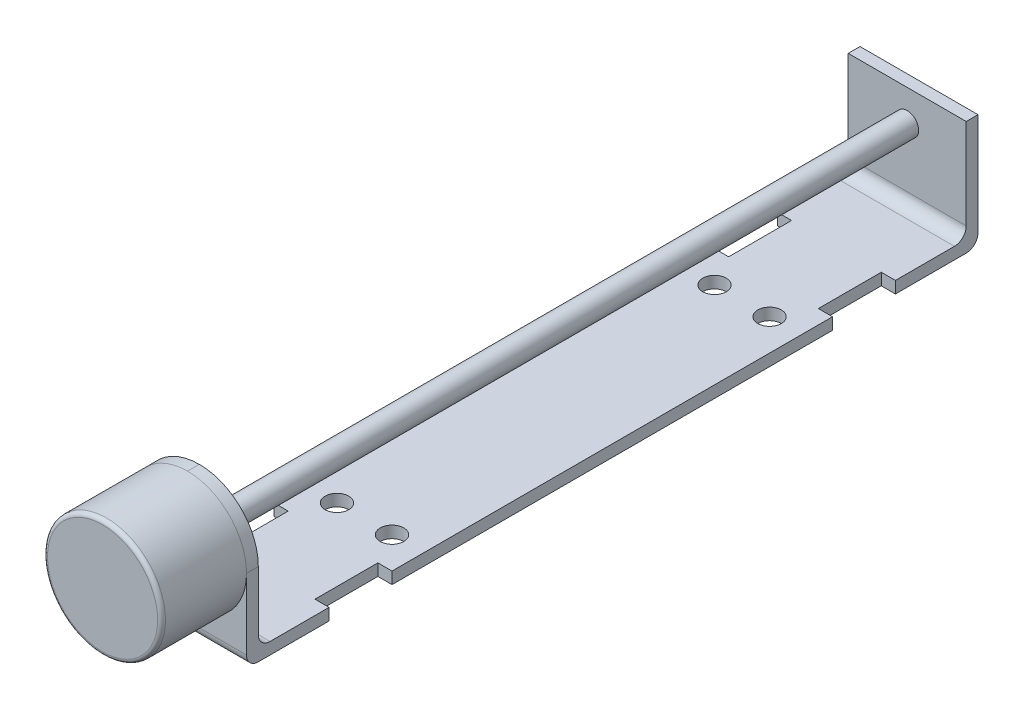
ISO-10303-21;
HEADER;
FILE_DESCRIPTION(('STEP AP214'),'2;1');
FILE_NAME('part.step','',(''),(''),'','','');
FILE_SCHEMA(('AUTOMOTIVE_DESIGN { 1 0 10303 214 1 1 1 1 }'));
ENDSEC;
DATA;
#1=APPLICATION_CONTEXT('core data for automotive mechanical design processes');
#2=APPLICATION_PROTOCOL_DEFINITION('international standard','automotive_design',2000,#1);
#3=PRODUCT_CONTEXT('',#1,'mechanical');
#4=PRODUCT('Part','Part','',(#3));
#5=PRODUCT_RELATED_PRODUCT_CATEGORY('part','',(#4));
#6=PRODUCT_DEFINITION_FORMATION('','',#4);
#7=PRODUCT_DEFINITION_CONTEXT('part definition',#1,'design');
#8=PRODUCT_DEFINITION('design','',#6,#7);
#9=PRODUCT_DEFINITION_SHAPE('','',#8);
#10=(LENGTH_UNIT() NAMED_UNIT(*) SI_UNIT(.MILLI.,.METRE.));
#11=(NAMED_UNIT(*) PLANE_ANGLE_UNIT() SI_UNIT($,.RADIAN.));
#12=(NAMED_UNIT(*) SI_UNIT($,.STERADIAN.) SOLID_ANGLE_UNIT());
#13=UNCERTAINTY_MEASURE_WITH_UNIT(LENGTH_MEASURE(1.E-05),#10,'distance_accuracy_value','');
#14=(GEOMETRIC_REPRESENTATION_CONTEXT(3) GLOBAL_UNCERTAINTY_ASSIGNED_CONTEXT((#13)) GLOBAL_UNIT_ASSIGNED_CONTEXT((#10,
#11,#12)) REPRESENTATION_CONTEXT('',''));
#15=CARTESIAN_POINT('',(0.,0.,0.));
#16=DIRECTION('',(0.,0.,1.));
#17=DIRECTION('',(1.,0.,0.));
#18=AXIS2_PLACEMENT_3D('',#15,#16,#17);
#19=CARTESIAN_POINT('',(15.,0.,0.));
#20=DIRECTION('',(1.,0.,0.));
#21=DIRECTION('',(0.,0.,-1.));
#22=AXIS2_PLACEMENT_3D('',#19,#20,#21);
#23=PLANE('',#22);
#24=DIRECTION('',(0.,-1.,0.));
#25=VECTOR('',#24,1.);
#26=CARTESIAN_POINT('',(15.,0.,36.));
#27=LINE('',#26,#25);
#28=CARTESIAN_POINT('',(15.,1.49999999999999,36.));
#29=VERTEX_POINT('',#28);
#30=CARTESIAN_POINT('',(15.,0.,36.));
#31=VERTEX_POINT('',#30);
#32=EDGE_CURVE('E240',#29,#31,#27,.T.);
#33=ORIENTED_EDGE('',*,*,#32,.F.);
#34=DIRECTION('',(0.,0.,1.));
#35=VECTOR('',#34,1.);
#36=CARTESIAN_POINT('',(15.,1.5,-45.));
#37=LINE('',#36,#35);
#38=CARTESIAN_POINT('',(15.,1.49999999999999,43.5));
#39=VERTEX_POINT('',#38);
#40=EDGE_CURVE('E341',#29,#39,#37,.T.);
#41=ORIENTED_EDGE('',*,*,#40,.T.);
#42=CARTESIAN_POINT('',(15.,2.99999999999999,43.5));
#43=DIRECTION('',(1.,0.,0.));
#44=DIRECTION('',(0.,0.,-1.));
#45=AXIS2_PLACEMENT_3D('',#42,#43,#44);
#46=CIRCLE('',#45,1.5);
#47=CARTESIAN_POINT('',(15.,2.99999999999999,45.));
#48=VERTEX_POINT('',#47);
#49=EDGE_CURVE('E414',#39,#48,#46,.F.);
#50=ORIENTED_EDGE('',*,*,#49,.T.);
#51=DIRECTION('',(0.,1.,0.));
#52=VECTOR('',#51,1.);
#53=CARTESIAN_POINT('',(15.,1.49999999999999,45.));
#54=LINE('',#53,#52);
#55=CARTESIAN_POINT('',(15.,10.5,45.));
#56=VERTEX_POINT('',#55);
#57=EDGE_CURVE('E345',#48,#56,#54,.T.);
#58=ORIENTED_EDGE('',*,*,#57,.T.);
#59=DIRECTION('',(0.,0.,1.));
#60=VECTOR('',#59,1.);
#61=CARTESIAN_POINT('',(15.,10.5,46.5));
#62=LINE('',#61,#60);
#63=CARTESIAN_POINT('',(15.,10.5,46.5));
#64=VERTEX_POINT('',#63);
#65=EDGE_CURVE('E423',#56,#64,#62,.T.);
#66=ORIENTED_EDGE('',*,*,#65,.T.);
#67=DIRECTION('',(0.,-1.,0.));
#68=VECTOR('',#67,1.);
#69=CARTESIAN_POINT('',(15.,18.,46.5));
#70=LINE('',#69,#68);
#71=CARTESIAN_POINT('',(15.,1.5,46.5));
#72=VERTEX_POINT('',#71);
#73=EDGE_CURVE('E327',#64,#72,#70,.T.);
#74=ORIENTED_EDGE('',*,*,#73,.T.);
#75=CARTESIAN_POINT('',(15.,1.5,45.));
#76=DIRECTION('',(1.,0.,0.));
#77=DIRECTION('',(0.,0.,-1.));
#78=AXIS2_PLACEMENT_3D('',#75,#76,#77);
#79=CIRCLE('',#78,1.5);
#80=CARTESIAN_POINT('',(15.,0.,45.));
#81=VERTEX_POINT('',#80);
#82=EDGE_CURVE('E397',#72,#81,#79,.T.);
#83=ORIENTED_EDGE('',*,*,#82,.T.);
#84=DIRECTION('',(0.,0.,-1.));
#85=VECTOR('',#84,1.);
#86=CARTESIAN_POINT('',(15.,0.,46.5));
#87=LINE('',#86,#85);
#88=EDGE_CURVE('E331',#81,#31,#87,.T.);
#89=ORIENTED_EDGE('',*,*,#88,.T.);
#90=EDGE_LOOP('',(#33,#41,#50,#58,#66,#74,#83,#89));
#91=FACE_BOUND('',#90,.T.);
#92=ADVANCED_FACE('F32',(#91),#23,.T.);
#93=DIRECTION('',(0.,1.,0.));
#94=VECTOR('',#93,1.);
#95=CARTESIAN_POINT('',(15.,0.,-35.9999999999999));
#96=LINE('',#95,#94);
#97=CARTESIAN_POINT('',(15.0000000000001,0.,-35.9999999999999));
#98=VERTEX_POINT('',#97);
#99=CARTESIAN_POINT('',(15.0000000000001,1.49999999999999,-35.9999999999999));
#100=VERTEX_POINT('',#99);
#101=EDGE_CURVE('E443',#98,#100,#96,.T.);
#102=ORIENTED_EDGE('',*,*,#101,.F.);
#103=CARTESIAN_POINT('',(15.,0.,-45.));
#104=VERTEX_POINT('',#103);
#105=EDGE_CURVE('E329',#98,#104,#87,.T.);
#106=ORIENTED_EDGE('',*,*,#105,.T.);
#107=CARTESIAN_POINT('',(15.,1.5,-45.));
#108=DIRECTION('',(1.,0.,0.));
#109=DIRECTION('',(0.,0.,-1.));
#110=AXIS2_PLACEMENT_3D('',#107,#108,#109);
#111=CIRCLE('',#110,1.5);
#112=CARTESIAN_POINT('',(15.,1.5,-46.5));
#113=VERTEX_POINT('',#112);
#114=EDGE_CURVE('E399',#104,#113,#111,.T.);
#115=ORIENTED_EDGE('',*,*,#114,.T.);
#116=DIRECTION('',(0.,1.,0.));
#117=VECTOR('',#116,1.);
#118=CARTESIAN_POINT('',(15.,0.,-46.5));
#119=LINE('',#118,#117);
#120=CARTESIAN_POINT('',(15.,14.5,-46.5));
#121=VERTEX_POINT('',#120);
#122=EDGE_CURVE('E333',#113,#121,#119,.T.);
#123=ORIENTED_EDGE('',*,*,#122,.T.);
#124=DIRECTION('',(0.,0.,1.));
#125=VECTOR('',#124,1.);
#126=CARTESIAN_POINT('',(15.,14.5,-46.5));
#127=LINE('',#126,#125);
#128=CARTESIAN_POINT('',(15.,14.5,-45.));
#129=VERTEX_POINT('',#128);
#130=EDGE_CURVE('E336',#121,#129,#127,.T.);
#131=ORIENTED_EDGE('',*,*,#130,.T.);
#132=DIRECTION('',(0.,-1.,0.));
#133=VECTOR('',#132,1.);
#134=CARTESIAN_POINT('',(15.,14.5,-45.));
#135=LINE('',#134,#133);
#136=CARTESIAN_POINT('',(15.,3.,-45.));
#137=VERTEX_POINT('',#136);
#138=EDGE_CURVE('E338',#129,#137,#135,.T.);
#139=ORIENTED_EDGE('',*,*,#138,.T.);
#140=CARTESIAN_POINT('',(15.,3.,-43.5));
#141=DIRECTION('',(1.,0.,0.));
#142=DIRECTION('',(0.,0.,-1.));
#143=AXIS2_PLACEMENT_3D('',#140,#141,#142);
#144=CIRCLE('',#143,1.5);
#145=CARTESIAN_POINT('',(15.,1.5,-43.5));
#146=VERTEX_POINT('',#145);
#147=EDGE_CURVE('E409',#137,#146,#144,.F.);
#148=ORIENTED_EDGE('',*,*,#147,.T.);
#149=EDGE_CURVE('E342',#146,#100,#37,.T.);
#150=ORIENTED_EDGE('',*,*,#149,.T.);
#151=EDGE_LOOP('',(#102,#106,#115,#123,#131,#139,#148,#150));
#152=FACE_BOUND('',#151,.T.);
#153=ADVANCED_FACE('F489',(#152),#23,.T.);
#154=CARTESIAN_POINT('',(0.,0.,0.));
#155=DIRECTION('',(1.,0.,0.));
#156=DIRECTION('',(0.,0.,-1.));
#157=AXIS2_PLACEMENT_3D('',#154,#155,#156);
#158=PLANE('',#157);
#159=DIRECTION('',(0.,0.,1.));
#160=VECTOR('',#159,1.);
#161=CARTESIAN_POINT('',(0.,1.5,-45.));
#162=LINE('',#161,#160);
#163=CARTESIAN_POINT('',(0.,1.49999999999999,36.));
#164=VERTEX_POINT('',#163);
#165=CARTESIAN_POINT('',(0.,1.49999999999999,43.5));
#166=VERTEX_POINT('',#165);
#167=EDGE_CURVE('E362',#164,#166,#162,.T.);
#168=ORIENTED_EDGE('',*,*,#167,.F.);
#169=DIRECTION('',(0.,-1.,0.));
#170=VECTOR('',#169,1.);
#171=CARTESIAN_POINT('',(0.,0.,36.));
#172=LINE('',#171,#170);
#173=CARTESIAN_POINT('',(0.,0.,36.));
#174=VERTEX_POINT('',#173);
#175=EDGE_CURVE('E438',#164,#174,#172,.T.);
#176=ORIENTED_EDGE('',*,*,#175,.T.);
#177=DIRECTION('',(0.,0.,-1.));
#178=VECTOR('',#177,1.);
#179=CARTESIAN_POINT('',(0.,0.,46.5));
#180=LINE('',#179,#178);
#181=CARTESIAN_POINT('',(0.,0.,45.));
#182=VERTEX_POINT('',#181);
#183=EDGE_CURVE('E352',#182,#174,#180,.T.);
#184=ORIENTED_EDGE('',*,*,#183,.F.);
#185=CARTESIAN_POINT('',(0.,1.5,45.));
#186=DIRECTION('',(1.,0.,0.));
#187=DIRECTION('',(0.,0.,-1.));
#188=AXIS2_PLACEMENT_3D('',#185,#186,#187);
#189=CIRCLE('',#188,1.5);
#190=CARTESIAN_POINT('',(0.,1.5,46.5));
#191=VERTEX_POINT('',#190);
#192=EDGE_CURVE('E385',#182,#191,#189,.F.);
#193=ORIENTED_EDGE('',*,*,#192,.T.);
#194=DIRECTION('',(0.,-1.,0.));
#195=VECTOR('',#194,1.);
#196=CARTESIAN_POINT('',(0.,18.,46.5));
#197=LINE('',#196,#195);
#198=CARTESIAN_POINT('',(0.,10.5,46.5));
#199=VERTEX_POINT('',#198);
#200=EDGE_CURVE('E324',#199,#191,#197,.T.);
#201=ORIENTED_EDGE('',*,*,#200,.F.);
#202=DIRECTION('',(0.,0.,1.));
#203=VECTOR('',#202,1.);
#204=CARTESIAN_POINT('',(0.,10.5,0.));
#205=LINE('',#204,#203);
#206=CARTESIAN_POINT('',(0.,10.5,45.));
#207=VERTEX_POINT('',#206);
#208=EDGE_CURVE('E416',#199,#207,#205,.F.);
#209=ORIENTED_EDGE('',*,*,#208,.T.);
#210=DIRECTION('',(0.,1.,0.));
#211=VECTOR('',#210,1.);
#212=CARTESIAN_POINT('',(0.,1.49999999999999,45.));
#213=LINE('',#212,#211);
#214=CARTESIAN_POINT('',(0.,2.99999999999999,45.));
#215=VERTEX_POINT('',#214);
#216=EDGE_CURVE('E330',#215,#207,#213,.T.);
#217=ORIENTED_EDGE('',*,*,#216,.F.);
#218=CARTESIAN_POINT('',(0.,2.99999999999999,43.5));
#219=DIRECTION('',(1.,0.,0.));
#220=DIRECTION('',(0.,0.,-1.));
#221=AXIS2_PLACEMENT_3D('',#218,#219,#220);
#222=CIRCLE('',#221,1.5);
#223=EDGE_CURVE('E411',#215,#166,#222,.T.);
#224=ORIENTED_EDGE('',*,*,#223,.T.);
#225=EDGE_LOOP('',(#168,#176,#184,#193,#201,#209,#217,#224));
#226=FACE_BOUND('',#225,.T.);
#227=ADVANCED_FACE('F496',(#226),#158,.F.);
#228=CARTESIAN_POINT('',(1.33226762955019E-13,0.,-36.));
#229=VERTEX_POINT('',#228);
#230=CARTESIAN_POINT('',(0.,0.,-45.));
#231=VERTEX_POINT('',#230);
#232=EDGE_CURVE('E351',#229,#231,#180,.T.);
#233=ORIENTED_EDGE('',*,*,#232,.F.);
#234=DIRECTION('',(0.,1.,0.));
#235=VECTOR('',#234,1.);
#236=CARTESIAN_POINT('',(0.,0.,-36.));
#237=LINE('',#236,#235);
#238=CARTESIAN_POINT('',(1.33226762955019E-13,1.49999999999999,-36.));
#239=VERTEX_POINT('',#238);
#240=EDGE_CURVE('E432',#229,#239,#237,.T.);
#241=ORIENTED_EDGE('',*,*,#240,.T.);
#242=CARTESIAN_POINT('',(0.,1.5,-43.5));
#243=VERTEX_POINT('',#242);
#244=EDGE_CURVE('E363',#243,#239,#162,.T.);
#245=ORIENTED_EDGE('',*,*,#244,.F.);
#246=CARTESIAN_POINT('',(0.,3.,-43.5));
#247=DIRECTION('',(1.,0.,0.));
#248=DIRECTION('',(0.,0.,-1.));
#249=AXIS2_PLACEMENT_3D('',#246,#247,#248);
#250=CIRCLE('',#249,1.5);
#251=CARTESIAN_POINT('',(0.,3.,-45.));
#252=VERTEX_POINT('',#251);
#253=EDGE_CURVE('E407',#243,#252,#250,.T.);
#254=ORIENTED_EDGE('',*,*,#253,.T.);
#255=DIRECTION('',(0.,-1.,0.));
#256=VECTOR('',#255,1.);
#257=CARTESIAN_POINT('',(0.,14.5,-45.));
#258=LINE('',#257,#256);
#259=CARTESIAN_POINT('',(0.,14.5,-45.));
#260=VERTEX_POINT('',#259);
#261=EDGE_CURVE('E359',#260,#252,#258,.T.);
#262=ORIENTED_EDGE('',*,*,#261,.F.);
#263=DIRECTION('',(0.,0.,1.));
#264=VECTOR('',#263,1.);
#265=CARTESIAN_POINT('',(0.,14.5,-46.5));
#266=LINE('',#265,#264);
#267=CARTESIAN_POINT('',(0.,14.5,-46.5));
#268=VERTEX_POINT('',#267);
#269=EDGE_CURVE('E357',#268,#260,#266,.T.);
#270=ORIENTED_EDGE('',*,*,#269,.F.);
#271=DIRECTION('',(0.,1.,0.));
#272=VECTOR('',#271,1.);
#273=CARTESIAN_POINT('',(0.,0.,-46.5));
#274=LINE('',#273,#272);
#275=CARTESIAN_POINT('',(0.,1.5,-46.5));
#276=VERTEX_POINT('',#275);
#277=EDGE_CURVE('E354',#276,#268,#274,.T.);
#278=ORIENTED_EDGE('',*,*,#277,.F.);
#279=CARTESIAN_POINT('',(0.,1.5,-45.));
#280=DIRECTION('',(1.,0.,0.));
#281=DIRECTION('',(0.,0.,-1.));
#282=AXIS2_PLACEMENT_3D('',#279,#280,#281);
#283=CIRCLE('',#282,1.5);
#284=EDGE_CURVE('E388',#276,#231,#283,.F.);
#285=ORIENTED_EDGE('',*,*,#284,.T.);
#286=EDGE_LOOP('',(#233,#241,#245,#254,#262,#270,#278,#285));
#287=FACE_BOUND('',#286,.T.);
#288=ADVANCED_FACE('F510',(#287),#158,.F.);
#289=CARTESIAN_POINT('',(15.,18.,46.5));
#290=DIRECTION('',(0.,0.,-1.));
#291=DIRECTION('',(-1.,0.,0.));
#292=AXIS2_PLACEMENT_3D('',#289,#290,#291);
#293=PLANE('',#292);
#294=CARTESIAN_POINT('',(7.5,10.5,46.5));
#295=DIRECTION('',(0.,0.,1.));
#296=DIRECTION('',(1.,0.,0.));
#297=AXIS2_PLACEMENT_3D('',#294,#295,#296);
#298=CIRCLE('',#297,7.5);
#299=EDGE_CURVE('E326',#199,#64,#298,.T.);
#300=ORIENTED_EDGE('',*,*,#299,.F.);
#301=ORIENTED_EDGE('',*,*,#200,.T.);
#302=DIRECTION('',(-1.,0.,0.));
#303=VECTOR('',#302,1.);
#304=CARTESIAN_POINT('',(15.,1.5,46.5));
#305=LINE('',#304,#303);
#306=EDGE_CURVE('E404',#191,#72,#305,.F.);
#307=ORIENTED_EDGE('',*,*,#306,.T.);
#308=ORIENTED_EDGE('',*,*,#73,.F.);
#309=EDGE_LOOP('',(#300,#301,#307,#308));
#310=FACE_BOUND('',#309,.T.);
#311=ADVANCED_FACE('F593',(#310),#293,.F.);
#312=CARTESIAN_POINT('',(15.,0.,46.5));
#313=DIRECTION('',(0.,1.,0.));
#314=DIRECTION('',(0.,0.,1.));
#315=AXIS2_PLACEMENT_3D('',#312,#313,#314);
#316=PLANE('',#315);
#317=CARTESIAN_POINT('',(11.0000000000001,0.,-23.9999999999999));
#318=DIRECTION('',(0.,-1.,0.));
#319=DIRECTION('',(0.,0.,-1.));
#320=AXIS2_PLACEMENT_3D('',#317,#318,#319);
#321=CIRCLE('',#320,1.5);
#322=CARTESIAN_POINT('',(11.0000000000001,0.,-25.4999999999999));
#323=VERTEX_POINT('',#322);
#324=EDGE_CURVE('E277',#323,#323,#321,.T.);
#325=ORIENTED_EDGE('',*,*,#324,.F.);
#326=EDGE_LOOP('',(#325));
#327=FACE_BOUND('',#326,.T.);
#328=CARTESIAN_POINT('',(4.00000000000009,0.,-24.));
#329=DIRECTION('',(0.,-1.,0.));
#330=DIRECTION('',(0.,0.,1.));
#331=AXIS2_PLACEMENT_3D('',#328,#329,#330);
#332=CIRCLE('',#331,1.5);
#333=CARTESIAN_POINT('',(4.00000000000009,0.,-22.5));
#334=VERTEX_POINT('',#333);
#335=EDGE_CURVE('E280',#334,#334,#332,.T.);
#336=ORIENTED_EDGE('',*,*,#335,.F.);
#337=EDGE_LOOP('',(#336));
#338=FACE_BOUND('',#337,.T.);
#339=CARTESIAN_POINT('',(11.,0.,24.));
#340=DIRECTION('',(0.,-1.,0.));
#341=DIRECTION('',(0.,0.,1.));
#342=AXIS2_PLACEMENT_3D('',#339,#340,#341);
#343=CIRCLE('',#342,1.5);
#344=CARTESIAN_POINT('',(11.,0.,25.5));
#345=VERTEX_POINT('',#344);
#346=EDGE_CURVE('E292',#345,#345,#343,.T.);
#347=ORIENTED_EDGE('',*,*,#346,.F.);
#348=EDGE_LOOP('',(#347));
#349=FACE_BOUND('',#348,.T.);
#350=CARTESIAN_POINT('',(4.,0.,24.));
#351=DIRECTION('',(0.,-1.,0.));
#352=DIRECTION('',(0.,0.,-1.));
#353=AXIS2_PLACEMENT_3D('',#350,#351,#352);
#354=CIRCLE('',#353,1.5);
#355=CARTESIAN_POINT('',(4.,0.,22.5));
#356=VERTEX_POINT('',#355);
#357=EDGE_CURVE('E295',#356,#356,#354,.T.);
#358=ORIENTED_EDGE('',*,*,#357,.F.);
#359=EDGE_LOOP('',(#358));
#360=FACE_BOUND('',#359,.T.);
#361=ORIENTED_EDGE('',*,*,#183,.T.);
#362=DIRECTION('',(-1.,0.,0.));
#363=VECTOR('',#362,1.);
#364=CARTESIAN_POINT('',(0.,0.,36.));
#365=LINE('',#364,#363);
#366=CARTESIAN_POINT('',(1.8,0.,36.));
#367=VERTEX_POINT('',#366);
#368=EDGE_CURVE('E287',#367,#174,#365,.T.);
#369=ORIENTED_EDGE('',*,*,#368,.F.);
#370=DIRECTION('',(0.,0.,1.));
#371=VECTOR('',#370,1.);
#372=CARTESIAN_POINT('',(1.8,0.,36.));
#373=LINE('',#372,#371);
#374=CARTESIAN_POINT('',(1.8,0.,28.));
#375=VERTEX_POINT('',#374);
#376=EDGE_CURVE('E284',#375,#367,#373,.T.);
#377=ORIENTED_EDGE('',*,*,#376,.F.);
#378=DIRECTION('',(1.,0.,0.));
#379=VECTOR('',#378,1.);
#380=CARTESIAN_POINT('',(0.,0.,28.));
#381=LINE('',#380,#379);
#382=CARTESIAN_POINT('',(0.,0.,28.));
#383=VERTEX_POINT('',#382);
#384=EDGE_CURVE('E252',#383,#375,#381,.T.);
#385=ORIENTED_EDGE('',*,*,#384,.F.);
#386=CARTESIAN_POINT('',(0.,0.,-28.));
#387=VERTEX_POINT('',#386);
#388=EDGE_CURVE('E355',#383,#387,#180,.T.);
#389=ORIENTED_EDGE('',*,*,#388,.T.);
#390=DIRECTION('',(-1.,0.,0.));
#391=VECTOR('',#390,1.);
#392=CARTESIAN_POINT('',(1.04586045879643E-13,0.,-28.));
#393=LINE('',#392,#391);
#394=CARTESIAN_POINT('',(1.8000000000001,0.,-28.));
#395=VERTEX_POINT('',#394);
#396=EDGE_CURVE('E272',#395,#387,#393,.T.);
#397=ORIENTED_EDGE('',*,*,#396,.F.);
#398=DIRECTION('',(0.,0.,1.));
#399=VECTOR('',#398,1.);
#400=CARTESIAN_POINT('',(1.80000000000013,0.,-36.));
#401=LINE('',#400,#399);
#402=CARTESIAN_POINT('',(1.80000000000013,0.,-36.));
#403=VERTEX_POINT('',#402);
#404=EDGE_CURVE('E269',#403,#395,#401,.T.);
#405=ORIENTED_EDGE('',*,*,#404,.F.);
#406=DIRECTION('',(1.,0.,0.));
#407=VECTOR('',#406,1.);
#408=CARTESIAN_POINT('',(1.33226762955019E-13,0.,-36.));
#409=LINE('',#408,#407);
#410=EDGE_CURVE('E266',#229,#403,#409,.T.);
#411=ORIENTED_EDGE('',*,*,#410,.F.);
#412=ORIENTED_EDGE('',*,*,#232,.T.);
#413=DIRECTION('',(-1.,0.,0.));
#414=VECTOR('',#413,1.);
#415=CARTESIAN_POINT('',(15.,0.,-45.));
#416=LINE('',#415,#414);
#417=EDGE_CURVE('E394',#231,#104,#416,.F.);
#418=ORIENTED_EDGE('',*,*,#417,.T.);
#419=ORIENTED_EDGE('',*,*,#105,.F.);
#420=DIRECTION('',(1.,0.,0.));
#421=VECTOR('',#420,1.);
#422=CARTESIAN_POINT('',(15.0000000000001,0.,-35.9999999999999));
#423=LINE('',#422,#421);
#424=CARTESIAN_POINT('',(13.2000000000001,0.,-35.9999999999999));
#425=VERTEX_POINT('',#424);
#426=EDGE_CURVE('E261',#425,#98,#423,.T.);
#427=ORIENTED_EDGE('',*,*,#426,.F.);
#428=DIRECTION('',(0.,0.,-1.));
#429=VECTOR('',#428,1.);
#430=CARTESIAN_POINT('',(13.2000000000001,0.,-35.9999999999999));
#431=LINE('',#430,#429);
#432=CARTESIAN_POINT('',(13.2000000000001,0.,-27.9999999999999));
#433=VERTEX_POINT('',#432);
#434=EDGE_CURVE('E257',#433,#425,#431,.T.);
#435=ORIENTED_EDGE('',*,*,#434,.F.);
#436=DIRECTION('',(-1.,0.,0.));
#437=VECTOR('',#436,1.);
#438=CARTESIAN_POINT('',(15.0000000000001,0.,-27.9999999999999));
#439=LINE('',#438,#437);
#440=CARTESIAN_POINT('',(15.0000000000001,0.,-27.9999999999999));
#441=VERTEX_POINT('',#440);
#442=EDGE_CURVE('E254',#441,#433,#439,.T.);
#443=ORIENTED_EDGE('',*,*,#442,.F.);
#444=CARTESIAN_POINT('',(15.,0.,28.));
#445=VERTEX_POINT('',#444);
#446=EDGE_CURVE('E334',#445,#441,#87,.T.);
#447=ORIENTED_EDGE('',*,*,#446,.F.);
#448=DIRECTION('',(1.,0.,0.));
#449=VECTOR('',#448,1.);
#450=CARTESIAN_POINT('',(15.,0.,28.));
#451=LINE('',#450,#449);
#452=CARTESIAN_POINT('',(13.2,0.,28.));
#453=VERTEX_POINT('',#452);
#454=EDGE_CURVE('E55',#453,#445,#451,.T.);
#455=ORIENTED_EDGE('',*,*,#454,.F.);
#456=DIRECTION('',(0.,0.,-1.));
#457=VECTOR('',#456,1.);
#458=CARTESIAN_POINT('',(13.2,0.,36.));
#459=LINE('',#458,#457);
#460=CARTESIAN_POINT('',(13.2,0.,36.));
#461=VERTEX_POINT('',#460);
#462=EDGE_CURVE('E229',#461,#453,#459,.T.);
#463=ORIENTED_EDGE('',*,*,#462,.F.);
#464=DIRECTION('',(-1.,0.,0.));
#465=VECTOR('',#464,1.);
#466=CARTESIAN_POINT('',(15.,0.,36.));
#467=LINE('',#466,#465);
#468=EDGE_CURVE('E237',#31,#461,#467,.T.);
#469=ORIENTED_EDGE('',*,*,#468,.F.);
#470=ORIENTED_EDGE('',*,*,#88,.F.);
#471=DIRECTION('',(-1.,0.,0.));
#472=VECTOR('',#471,1.);
#473=CARTESIAN_POINT('',(15.,0.,45.));
#474=LINE('',#473,#472);
#475=EDGE_CURVE('E391',#81,#182,#474,.T.);
#476=ORIENTED_EDGE('',*,*,#475,.T.);
#477=EDGE_LOOP('',(#361,#369,#377,#385,#389,#397,#405,#411,#412,#418,#419,#427,#435,#443,#447,
#455,#463,#469,#470,#476));
#478=FACE_BOUND('',#477,.T.);
#479=ADVANCED_FACE('F247',(#327,#338,#349,#360,#478),#316,.F.);
#480=CARTESIAN_POINT('',(15.,0.,-46.5));
#481=DIRECTION('',(0.,0.,1.));
#482=DIRECTION('',(1.,0.,0.));
#483=AXIS2_PLACEMENT_3D('',#480,#481,#482);
#484=PLANE('',#483);
#485=ORIENTED_EDGE('',*,*,#122,.F.);
#486=DIRECTION('',(-1.,0.,0.));
#487=VECTOR('',#486,1.);
#488=CARTESIAN_POINT('',(15.,1.5,-46.5));
#489=LINE('',#488,#487);
#490=EDGE_CURVE('E382',#113,#276,#489,.T.);
#491=ORIENTED_EDGE('',*,*,#490,.T.);
#492=ORIENTED_EDGE('',*,*,#277,.T.);
#493=DIRECTION('',(-1.,0.,0.));
#494=VECTOR('',#493,1.);
#495=CARTESIAN_POINT('',(15.,14.5,-46.5));
#496=LINE('',#495,#494);
#497=EDGE_CURVE('E371',#121,#268,#496,.T.);
#498=ORIENTED_EDGE('',*,*,#497,.F.);
#499=EDGE_LOOP('',(#485,#491,#492,#498));
#500=FACE_BOUND('',#499,.T.);
#501=ADVANCED_FACE('F532',(#500),#484,.F.);
#502=CARTESIAN_POINT('',(15.,14.5,-46.5));
#503=DIRECTION('',(0.,-1.,0.));
#504=DIRECTION('',(0.,0.,-1.));
#505=AXIS2_PLACEMENT_3D('',#502,#503,#504);
#506=PLANE('',#505);
#507=ORIENTED_EDGE('',*,*,#269,.T.);
#508=DIRECTION('',(-1.,0.,0.));
#509=VECTOR('',#508,1.);
#510=CARTESIAN_POINT('',(15.,14.5,-45.));
#511=LINE('',#510,#509);
#512=EDGE_CURVE('E349',#129,#260,#511,.T.);
#513=ORIENTED_EDGE('',*,*,#512,.F.);
#514=ORIENTED_EDGE('',*,*,#130,.F.);
#515=ORIENTED_EDGE('',*,*,#497,.T.);
#516=EDGE_LOOP('',(#507,#513,#514,#515));
#517=FACE_BOUND('',#516,.T.);
#518=ADVANCED_FACE('F539',(#517),#506,.F.);
#519=CARTESIAN_POINT('',(15.,14.5,-45.));
#520=DIRECTION('',(0.,0.,-1.));
#521=DIRECTION('',(0.,1.,0.));
#522=AXIS2_PLACEMENT_3D('',#519,#520,#521);
#523=PLANE('',#522);
#524=CARTESIAN_POINT('',(7.5,10.5,-45.));
#525=DIRECTION('',(0.,0.,-1.));
#526=DIRECTION('',(0.,1.,0.));
#527=AXIS2_PLACEMENT_3D('',#524,#525,#526);
#528=CIRCLE('',#527,1.45);
#529=CARTESIAN_POINT('',(7.5,11.95,-45.));
#530=VERTEX_POINT('',#529);
#531=EDGE_CURVE('E471',#530,#530,#528,.F.);
#532=ORIENTED_EDGE('',*,*,#531,.F.);
#533=EDGE_LOOP('',(#532));
#534=FACE_BOUND('',#533,.T.);
#535=ORIENTED_EDGE('',*,*,#261,.T.);
#536=DIRECTION('',(-1.,0.,0.));
#537=VECTOR('',#536,1.);
#538=CARTESIAN_POINT('',(15.,3.,-45.));
#539=LINE('',#538,#537);
#540=EDGE_CURVE('E380',#252,#137,#539,.F.);
#541=ORIENTED_EDGE('',*,*,#540,.T.);
#542=ORIENTED_EDGE('',*,*,#138,.F.);
#543=ORIENTED_EDGE('',*,*,#512,.T.);
#544=EDGE_LOOP('',(#535,#541,#542,#543));
#545=FACE_BOUND('',#544,.T.);
#546=ADVANCED_FACE('F543',(#534,#545),#523,.F.);
#547=CARTESIAN_POINT('',(15.,1.5,-45.));
#548=DIRECTION('',(0.,-1.,0.));
#549=DIRECTION('',(0.,0.,-1.));
#550=AXIS2_PLACEMENT_3D('',#547,#548,#549);
#551=PLANE('',#550);
#552=CARTESIAN_POINT('',(11.0000000000001,1.49999999999999,-23.9999999999999));
#553=DIRECTION('',(0.,-1.,0.));
#554=DIRECTION('',(0.,0.,-1.));
#555=AXIS2_PLACEMENT_3D('',#552,#553,#554);
#556=CIRCLE('',#555,1.5);
#557=CARTESIAN_POINT('',(11.0000000000001,1.49999999999999,-25.4999999999999));
#558=VERTEX_POINT('',#557);
#559=EDGE_CURVE('E429',#558,#558,#556,.T.);
#560=ORIENTED_EDGE('',*,*,#559,.T.);
#561=EDGE_LOOP('',(#560));
#562=FACE_BOUND('',#561,.T.);
#563=CARTESIAN_POINT('',(4.00000000000009,1.49999999999999,-24.));
#564=DIRECTION('',(0.,-1.,0.));
#565=DIRECTION('',(0.,0.,-1.));
#566=AXIS2_PLACEMENT_3D('',#563,#564,#565);
#567=CIRCLE('',#566,1.5);
#568=CARTESIAN_POINT('',(4.00000000000009,1.49999999999999,-25.5));
#569=VERTEX_POINT('',#568);
#570=EDGE_CURVE('E461',#569,#569,#567,.T.);
#571=ORIENTED_EDGE('',*,*,#570,.T.);
#572=EDGE_LOOP('',(#571));
#573=FACE_BOUND('',#572,.T.);
#574=CARTESIAN_POINT('',(11.,1.49999999999999,24.));
#575=DIRECTION('',(0.,-1.,0.));
#576=DIRECTION('',(0.,0.,-1.));
#577=AXIS2_PLACEMENT_3D('',#574,#575,#576);
#578=CIRCLE('',#577,1.5);
#579=CARTESIAN_POINT('',(11.,1.49999999999999,22.5));
#580=VERTEX_POINT('',#579);
#581=EDGE_CURVE('E451',#580,#580,#578,.T.);
#582=ORIENTED_EDGE('',*,*,#581,.T.);
#583=EDGE_LOOP('',(#582));
#584=FACE_BOUND('',#583,.T.);
#585=DIRECTION('',(0.,0.,1.));
#586=VECTOR('',#585,1.);
#587=CARTESIAN_POINT('',(1.80000000000001,1.5,-45.));
#588=LINE('',#587,#586);
#589=CARTESIAN_POINT('',(1.8,1.49999999999999,28.));
#590=VERTEX_POINT('',#589);
#591=CARTESIAN_POINT('',(1.8,1.49999999999999,36.));
#592=VERTEX_POINT('',#591);
#593=EDGE_CURVE('E458',#590,#592,#588,.T.);
#594=ORIENTED_EDGE('',*,*,#593,.T.);
#595=DIRECTION('',(-1.,0.,0.));
#596=VECTOR('',#595,1.);
#597=CARTESIAN_POINT('',(15.,1.49999999999999,36.));
#598=LINE('',#597,#596);
#599=EDGE_CURVE('E309',#592,#164,#598,.T.);
#600=ORIENTED_EDGE('',*,*,#599,.T.);
#601=ORIENTED_EDGE('',*,*,#167,.T.);
#602=DIRECTION('',(-1.,0.,0.));
#603=VECTOR('',#602,1.);
#604=CARTESIAN_POINT('',(15.,1.49999999999999,43.5));
#605=LINE('',#604,#603);
#606=EDGE_CURVE('E374',#166,#39,#605,.F.);
#607=ORIENTED_EDGE('',*,*,#606,.T.);
#608=ORIENTED_EDGE('',*,*,#40,.F.);
#609=DIRECTION('',(-1.,0.,0.));
#610=VECTOR('',#609,1.);
#611=CARTESIAN_POINT('',(15.,1.49999999999999,36.));
#612=LINE('',#611,#610);
#613=CARTESIAN_POINT('',(13.2,1.49999999999999,36.));
#614=VERTEX_POINT('',#613);
#615=EDGE_CURVE('E319',#29,#614,#612,.T.);
#616=ORIENTED_EDGE('',*,*,#615,.T.);
#617=DIRECTION('',(0.,0.,-1.));
#618=VECTOR('',#617,1.);
#619=CARTESIAN_POINT('',(13.2,1.5,-45.));
#620=LINE('',#619,#618);
#621=CARTESIAN_POINT('',(13.2,1.49999999999999,28.));
#622=VERTEX_POINT('',#621);
#623=EDGE_CURVE('E231',#614,#622,#620,.T.);
#624=ORIENTED_EDGE('',*,*,#623,.T.);
#625=DIRECTION('',(1.,0.,0.));
#626=VECTOR('',#625,1.);
#627=CARTESIAN_POINT('',(15.,1.49999999999999,28.));
#628=LINE('',#627,#626);
#629=CARTESIAN_POINT('',(15.,1.49999999999999,28.));
#630=VERTEX_POINT('',#629);
#631=EDGE_CURVE('E316',#622,#630,#628,.T.);
#632=ORIENTED_EDGE('',*,*,#631,.T.);
#633=CARTESIAN_POINT('',(15.,1.5,-27.9999999999999));
#634=VERTEX_POINT('',#633);
#635=EDGE_CURVE('E346',#634,#630,#37,.T.);
#636=ORIENTED_EDGE('',*,*,#635,.F.);
#637=DIRECTION('',(-1.,0.,0.));
#638=VECTOR('',#637,1.);
#639=CARTESIAN_POINT('',(14.9999999999999,1.5,-27.9999999999999));
#640=LINE('',#639,#638);
#641=CARTESIAN_POINT('',(13.2000000000001,1.5,-27.9999999999999));
#642=VERTEX_POINT('',#641);
#643=EDGE_CURVE('E47',#634,#642,#640,.T.);
#644=ORIENTED_EDGE('',*,*,#643,.T.);
#645=DIRECTION('',(0.,0.,-1.));
#646=VECTOR('',#645,1.);
#647=CARTESIAN_POINT('',(13.2000000000002,1.5,-45.));
#648=LINE('',#647,#646);
#649=CARTESIAN_POINT('',(13.2000000000001,1.5,-35.9999999999999));
#650=VERTEX_POINT('',#649);
#651=EDGE_CURVE('E454',#642,#650,#648,.T.);
#652=ORIENTED_EDGE('',*,*,#651,.T.);
#653=DIRECTION('',(1.,0.,0.));
#654=VECTOR('',#653,1.);
#655=CARTESIAN_POINT('',(15.,1.5,-35.9999999999999));
#656=LINE('',#655,#654);
#657=EDGE_CURVE('E313',#650,#100,#656,.T.);
#658=ORIENTED_EDGE('',*,*,#657,.T.);
#659=ORIENTED_EDGE('',*,*,#149,.F.);
#660=DIRECTION('',(-1.,0.,0.));
#661=VECTOR('',#660,1.);
#662=CARTESIAN_POINT('',(0.,1.5,-43.5));
#663=LINE('',#662,#661);
#664=EDGE_CURVE('E377',#146,#243,#663,.T.);
#665=ORIENTED_EDGE('',*,*,#664,.T.);
#666=ORIENTED_EDGE('',*,*,#244,.T.);
#667=DIRECTION('',(1.,0.,0.));
#668=VECTOR('',#667,1.);
#669=CARTESIAN_POINT('',(15.,1.5,-36.));
#670=LINE('',#669,#668);
#671=CARTESIAN_POINT('',(1.80000000000013,1.5,-36.));
#672=VERTEX_POINT('',#671);
#673=EDGE_CURVE('E303',#239,#672,#670,.T.);
#674=ORIENTED_EDGE('',*,*,#673,.T.);
#675=DIRECTION('',(0.,0.,1.));
#676=VECTOR('',#675,1.);
#677=CARTESIAN_POINT('',(1.80000000000016,1.5,-45.));
#678=LINE('',#677,#676);
#679=CARTESIAN_POINT('',(1.8000000000001,1.5,-28.));
#680=VERTEX_POINT('',#679);
#681=EDGE_CURVE('E448',#672,#680,#678,.T.);
#682=ORIENTED_EDGE('',*,*,#681,.T.);
#683=DIRECTION('',(-1.,0.,0.));
#684=VECTOR('',#683,1.);
#685=CARTESIAN_POINT('',(14.9999999999999,1.5,-27.9999999999999));
#686=LINE('',#685,#684);
#687=CARTESIAN_POINT('',(1.04586045879643E-13,1.49999999999999,-28.));
#688=VERTEX_POINT('',#687);
#689=EDGE_CURVE('E300',#680,#688,#686,.T.);
#690=ORIENTED_EDGE('',*,*,#689,.T.);
#691=CARTESIAN_POINT('',(0.,1.49999999999999,28.));
#692=VERTEX_POINT('',#691);
#693=EDGE_CURVE('E366',#688,#692,#162,.T.);
#694=ORIENTED_EDGE('',*,*,#693,.T.);
#695=DIRECTION('',(1.,0.,0.));
#696=VECTOR('',#695,1.);
#697=CARTESIAN_POINT('',(15.,1.49999999999999,28.));
#698=LINE('',#697,#696);
#699=EDGE_CURVE('E306',#692,#590,#698,.T.);
#700=ORIENTED_EDGE('',*,*,#699,.T.);
#701=EDGE_LOOP('',(#594,#600,#601,#607,#608,#616,#624,#632,#636,#644,#652,#658,#659,#665,#666,
#674,#682,#690,#694,#700));
#702=FACE_BOUND('',#701,.T.);
#703=CARTESIAN_POINT('',(4.,1.49999999999999,24.));
#704=DIRECTION('',(0.,-1.,0.));
#705=DIRECTION('',(0.,0.,-1.));
#706=AXIS2_PLACEMENT_3D('',#703,#704,#705);
#707=CIRCLE('',#706,1.5);
#708=CARTESIAN_POINT('',(4.,1.49999999999999,22.5));
#709=VERTEX_POINT('',#708);
#710=EDGE_CURVE('E321',#709,#709,#707,.T.);
#711=ORIENTED_EDGE('',*,*,#710,.T.);
#712=EDGE_LOOP('',(#711));
#713=FACE_BOUND('',#712,.T.);
#714=ADVANCED_FACE('F511',(#562,#573,#584,#702,#713),#551,.F.);
#715=CARTESIAN_POINT('',(15.,1.49999999999999,45.));
#716=DIRECTION('',(0.,0.,1.));
#717=DIRECTION('',(1.,0.,0.));
#718=AXIS2_PLACEMENT_3D('',#715,#716,#717);
#719=PLANE('',#718);
#720=CARTESIAN_POINT('',(7.5,10.5,45.));
#721=DIRECTION('',(0.,0.,1.));
#722=DIRECTION('',(1.,0.,0.));
#723=AXIS2_PLACEMENT_3D('',#720,#721,#722);
#724=CIRCLE('',#723,1.45);
#725=CARTESIAN_POINT('',(8.95,10.5,45.));
#726=VERTEX_POINT('',#725);
#727=EDGE_CURVE('E468',#726,#726,#724,.F.);
#728=ORIENTED_EDGE('',*,*,#727,.F.);
#729=EDGE_LOOP('',(#728));
#730=FACE_BOUND('',#729,.T.);
#731=ORIENTED_EDGE('',*,*,#216,.T.);
#732=CARTESIAN_POINT('',(7.5,10.5,45.));
#733=DIRECTION('',(0.,0.,1.));
#734=DIRECTION('',(1.,0.,0.));
#735=AXIS2_PLACEMENT_3D('',#732,#733,#734);
#736=CIRCLE('',#735,7.5);
#737=CARTESIAN_POINT('',(7.5,18.,45.));
#738=VERTEX_POINT('',#737);
#739=EDGE_CURVE('E421',#207,#738,#736,.F.);
#740=ORIENTED_EDGE('',*,*,#739,.T.);
#741=CARTESIAN_POINT('',(7.5,10.5,45.));
#742=DIRECTION('',(0.,0.,1.));
#743=DIRECTION('',(1.,0.,0.));
#744=AXIS2_PLACEMENT_3D('',#741,#742,#743);
#745=CIRCLE('',#744,7.5);
#746=EDGE_CURVE('E419',#738,#56,#745,.F.);
#747=ORIENTED_EDGE('',*,*,#746,.T.);
#748=ORIENTED_EDGE('',*,*,#57,.F.);
#749=DIRECTION('',(-1.,0.,0.));
#750=VECTOR('',#749,1.);
#751=CARTESIAN_POINT('',(0.,2.99999999999999,45.));
#752=LINE('',#751,#750);
#753=EDGE_CURVE('E401',#48,#215,#752,.T.);
#754=ORIENTED_EDGE('',*,*,#753,.T.);
#755=EDGE_LOOP('',(#731,#740,#747,#748,#754));
#756=FACE_BOUND('',#755,.T.);
#757=ADVANCED_FACE('F502',(#730,#756),#719,.F.);
#758=DIRECTION('',(0.,1.,0.));
#759=VECTOR('',#758,1.);
#760=CARTESIAN_POINT('',(15.,0.,28.));
#761=LINE('',#760,#759);
#762=EDGE_CURVE('E445',#445,#630,#761,.T.);
#763=ORIENTED_EDGE('',*,*,#762,.F.);
#764=ORIENTED_EDGE('',*,*,#446,.T.);
#765=DIRECTION('',(0.,-1.,0.));
#766=VECTOR('',#765,1.);
#767=CARTESIAN_POINT('',(15.,0.,-27.9999999999999));
#768=LINE('',#767,#766);
#769=EDGE_CURVE('E441',#634,#441,#768,.T.);
#770=ORIENTED_EDGE('',*,*,#769,.F.);
#771=ORIENTED_EDGE('',*,*,#635,.T.);
#772=EDGE_LOOP('',(#763,#764,#770,#771));
#773=FACE_BOUND('',#772,.T.);
#774=ADVANCED_FACE('F492',(#773),#23,.T.);
#775=ORIENTED_EDGE('',*,*,#388,.F.);
#776=DIRECTION('',(0.,1.,0.));
#777=VECTOR('',#776,1.);
#778=CARTESIAN_POINT('',(0.,0.,28.));
#779=LINE('',#778,#777);
#780=EDGE_CURVE('E435',#383,#692,#779,.T.);
#781=ORIENTED_EDGE('',*,*,#780,.T.);
#782=ORIENTED_EDGE('',*,*,#693,.F.);
#783=DIRECTION('',(0.,-1.,0.));
#784=VECTOR('',#783,1.);
#785=CARTESIAN_POINT('',(0.,0.,-28.));
#786=LINE('',#785,#784);
#787=EDGE_CURVE('E425',#688,#387,#786,.T.);
#788=ORIENTED_EDGE('',*,*,#787,.T.);
#789=EDGE_LOOP('',(#775,#781,#782,#788));
#790=FACE_BOUND('',#789,.T.);
#791=ADVANCED_FACE('F501',(#790),#158,.F.);
#792=CARTESIAN_POINT('',(15.,3.,-43.5));
#793=DIRECTION('',(1.,0.,0.));
#794=DIRECTION('',(0.,0.,-1.));
#795=AXIS2_PLACEMENT_3D('',#792,#793,#794);
#796=CYLINDRICAL_SURFACE('',#795,1.5);
#797=ORIENTED_EDGE('',*,*,#147,.F.);
#798=ORIENTED_EDGE('',*,*,#540,.F.);
#799=ORIENTED_EDGE('',*,*,#253,.F.);
#800=ORIENTED_EDGE('',*,*,#664,.F.);
#801=EDGE_LOOP('',(#797,#798,#799,#800));
#802=FACE_BOUND('',#801,.T.);
#803=ADVANCED_FACE('F508',(#802),#796,.F.);
#804=CARTESIAN_POINT('',(15.,1.5,-45.));
#805=DIRECTION('',(-1.,0.,0.));
#806=DIRECTION('',(0.,0.,1.));
#807=AXIS2_PLACEMENT_3D('',#804,#805,#806);
#808=CYLINDRICAL_SURFACE('',#807,1.5);
#809=ORIENTED_EDGE('',*,*,#114,.F.);
#810=ORIENTED_EDGE('',*,*,#417,.F.);
#811=ORIENTED_EDGE('',*,*,#284,.F.);
#812=ORIENTED_EDGE('',*,*,#490,.F.);
#813=EDGE_LOOP('',(#809,#810,#811,#812));
#814=FACE_BOUND('',#813,.T.);
#815=ADVANCED_FACE('F529',(#814),#808,.T.);
#816=CARTESIAN_POINT('',(15.,2.99999999999999,43.5));
#817=DIRECTION('',(1.,0.,0.));
#818=DIRECTION('',(0.,0.,-1.));
#819=AXIS2_PLACEMENT_3D('',#816,#817,#818);
#820=CYLINDRICAL_SURFACE('',#819,1.5);
#821=ORIENTED_EDGE('',*,*,#49,.F.);
#822=ORIENTED_EDGE('',*,*,#606,.F.);
#823=ORIENTED_EDGE('',*,*,#223,.F.);
#824=ORIENTED_EDGE('',*,*,#753,.F.);
#825=EDGE_LOOP('',(#821,#822,#823,#824));
#826=FACE_BOUND('',#825,.T.);
#827=ADVANCED_FACE('F573',(#826),#820,.F.);
#828=CARTESIAN_POINT('',(15.,1.5,45.));
#829=DIRECTION('',(-1.,0.,0.));
#830=DIRECTION('',(0.,0.,1.));
#831=AXIS2_PLACEMENT_3D('',#828,#829,#830);
#832=CYLINDRICAL_SURFACE('',#831,1.5);
#833=ORIENTED_EDGE('',*,*,#82,.F.);
#834=ORIENTED_EDGE('',*,*,#306,.F.);
#835=ORIENTED_EDGE('',*,*,#192,.F.);
#836=ORIENTED_EDGE('',*,*,#475,.F.);
#837=EDGE_LOOP('',(#833,#834,#835,#836));
#838=FACE_BOUND('',#837,.T.);
#839=ADVANCED_FACE('F599',(#838),#832,.T.);
#840=CARTESIAN_POINT('',(7.5,10.5,57.3));
#841=DIRECTION('',(0.,0.,-1.));
#842=DIRECTION('',(-1.,0.,0.));
#843=AXIS2_PLACEMENT_3D('',#840,#841,#842);
#844=CYLINDRICAL_SURFACE('',#843,7.5);
#845=CARTESIAN_POINT('',(7.5,10.5,56.8));
#846=DIRECTION('',(0.,0.,1.));
#847=DIRECTION('',(1.,0.,0.));
#848=AXIS2_PLACEMENT_3D('',#845,#846,#847);
#849=CIRCLE('',#848,7.5);
#850=CARTESIAN_POINT('',(15.,10.5,56.8));
#851=VERTEX_POINT('',#850);
#852=EDGE_CURVE('E11',#851,#851,#849,.F.);
#853=ORIENTED_EDGE('',*,*,#852,.T.);
#854=EDGE_LOOP('',(#853));
#855=FACE_BOUND('',#854,.T.);
#856=CARTESIAN_POINT('',(7.5,18.,46.5));
#857=VERTEX_POINT('',#856);
#858=EDGE_CURVE('E322',#64,#857,#298,.T.);
#859=ORIENTED_EDGE('',*,*,#858,.T.);
#860=EDGE_CURVE('E325',#857,#199,#298,.T.);
#861=ORIENTED_EDGE('',*,*,#860,.T.);
#862=ORIENTED_EDGE('',*,*,#299,.T.);
#863=EDGE_LOOP('',(#859,#861,#862));
#864=FACE_BOUND('',#863,.T.);
#865=ADVANCED_FACE('F590',(#855,#864),#844,.T.);
#866=CARTESIAN_POINT('',(7.5,10.5,57.3));
#867=DIRECTION('',(0.,0.,1.));
#868=DIRECTION('',(1.,0.,0.));
#869=AXIS2_PLACEMENT_3D('',#866,#867,#868);
#870=PLANE('',#869);
#871=CARTESIAN_POINT('',(7.5,10.5,57.3));
#872=DIRECTION('',(0.,0.,1.));
#873=DIRECTION('',(1.,0.,0.));
#874=AXIS2_PLACEMENT_3D('',#871,#872,#873);
#875=CIRCLE('',#874,7.);
#876=CARTESIAN_POINT('',(14.5,10.5,57.3));
#877=VERTEX_POINT('',#876);
#878=EDGE_CURVE('E40',#877,#877,#875,.T.);
#879=ORIENTED_EDGE('',*,*,#878,.T.);
#880=EDGE_LOOP('',(#879));
#881=FACE_BOUND('',#880,.T.);
#882=ADVANCED_FACE('F476',(#881),#870,.T.);
#883=CARTESIAN_POINT('',(7.5,10.5,0.));
#884=DIRECTION('',(0.,0.,-1.));
#885=DIRECTION('',(-1.,0.,0.));
#886=AXIS2_PLACEMENT_3D('',#883,#884,#885);
#887=CYLINDRICAL_SURFACE('',#886,7.5);
#888=ORIENTED_EDGE('',*,*,#65,.F.);
#889=ORIENTED_EDGE('',*,*,#746,.F.);
#890=DIRECTION('',(0.,0.,1.));
#891=VECTOR('',#890,1.);
#892=CARTESIAN_POINT('',(7.5,18.,45.));
#893=LINE('',#892,#891);
#894=EDGE_CURVE('E426',#857,#738,#893,.F.);
#895=ORIENTED_EDGE('',*,*,#894,.F.);
#896=ORIENTED_EDGE('',*,*,#858,.F.);
#897=EDGE_LOOP('',(#888,#889,#895,#896));
#898=FACE_BOUND('',#897,.T.);
#899=ADVANCED_FACE('F580',(#898),#887,.T.);
#900=CARTESIAN_POINT('',(7.5,10.5,45.));
#901=DIRECTION('',(0.,0.,1.));
#902=DIRECTION('',(1.,0.,0.));
#903=AXIS2_PLACEMENT_3D('',#900,#901,#902);
#904=CYLINDRICAL_SURFACE('',#903,7.5);
#905=ORIENTED_EDGE('',*,*,#739,.F.);
#906=ORIENTED_EDGE('',*,*,#208,.F.);
#907=ORIENTED_EDGE('',*,*,#860,.F.);
#908=ORIENTED_EDGE('',*,*,#894,.T.);
#909=EDGE_LOOP('',(#905,#906,#907,#908));
#910=FACE_BOUND('',#909,.T.);
#911=ADVANCED_FACE('F584',(#910),#904,.T.);
#912=CARTESIAN_POINT('',(1.80000000000013,18.,-36.));
#913=DIRECTION('',(1.,0.,0.));
#914=DIRECTION('',(0.,0.,-1.));
#915=AXIS2_PLACEMENT_3D('',#912,#913,#914);
#916=PLANE('',#915);
#917=DIRECTION('',(0.,-1.,0.));
#918=VECTOR('',#917,1.);
#919=CARTESIAN_POINT('',(1.80000000000013,18.,-36.));
#920=LINE('',#919,#918);
#921=EDGE_CURVE('E274',#672,#403,#920,.T.);
#922=ORIENTED_EDGE('',*,*,#921,.T.);
#923=ORIENTED_EDGE('',*,*,#404,.T.);
#924=DIRECTION('',(0.,-1.,0.));
#925=VECTOR('',#924,1.);
#926=CARTESIAN_POINT('',(1.8000000000001,18.,-28.));
#927=LINE('',#926,#925);
#928=EDGE_CURVE('E258',#680,#395,#927,.T.);
#929=ORIENTED_EDGE('',*,*,#928,.F.);
#930=ORIENTED_EDGE('',*,*,#681,.F.);
#931=EDGE_LOOP('',(#922,#923,#929,#930));
#932=FACE_BOUND('',#931,.T.);
#933=ADVANCED_FACE('F560',(#932),#916,.F.);
#934=CARTESIAN_POINT('',(1.33226762955019E-13,18.,-36.));
#935=DIRECTION('',(0.,0.,-1.));
#936=DIRECTION('',(-1.,0.,0.));
#937=AXIS2_PLACEMENT_3D('',#934,#935,#936);
#938=PLANE('',#937);
#939=ORIENTED_EDGE('',*,*,#240,.F.);
#940=ORIENTED_EDGE('',*,*,#410,.T.);
#941=ORIENTED_EDGE('',*,*,#921,.F.);
#942=ORIENTED_EDGE('',*,*,#673,.F.);
#943=EDGE_LOOP('',(#939,#940,#941,#942));
#944=FACE_BOUND('',#943,.T.);
#945=ADVANCED_FACE('F553',(#944),#938,.F.);
#946=CARTESIAN_POINT('',(1.04586045879643E-13,18.,-28.));
#947=DIRECTION('',(0.,0.,1.));
#948=DIRECTION('',(1.,0.,0.));
#949=AXIS2_PLACEMENT_3D('',#946,#947,#948);
#950=PLANE('',#949);
#951=ORIENTED_EDGE('',*,*,#928,.T.);
#952=ORIENTED_EDGE('',*,*,#396,.T.);
#953=ORIENTED_EDGE('',*,*,#787,.F.);
#954=ORIENTED_EDGE('',*,*,#689,.F.);
#955=EDGE_LOOP('',(#951,#952,#953,#954));
#956=FACE_BOUND('',#955,.T.);
#957=ADVANCED_FACE('F674',(#956),#950,.F.);
#958=CARTESIAN_POINT('',(1.8,18.,36.));
#959=DIRECTION('',(1.,0.,0.));
#960=DIRECTION('',(0.,0.,-1.));
#961=AXIS2_PLACEMENT_3D('',#958,#959,#960);
#962=PLANE('',#961);
#963=DIRECTION('',(0.,-1.,0.));
#964=VECTOR('',#963,1.);
#965=CARTESIAN_POINT('',(1.8,18.,28.));
#966=LINE('',#965,#964);
#967=EDGE_CURVE('E289',#590,#375,#966,.T.);
#968=ORIENTED_EDGE('',*,*,#967,.T.);
#969=ORIENTED_EDGE('',*,*,#376,.T.);
#970=DIRECTION('',(0.,-1.,0.));
#971=VECTOR('',#970,1.);
#972=CARTESIAN_POINT('',(1.8,18.,36.));
#973=LINE('',#972,#971);
#974=EDGE_CURVE('E281',#592,#367,#973,.T.);
#975=ORIENTED_EDGE('',*,*,#974,.F.);
#976=ORIENTED_EDGE('',*,*,#593,.F.);
#977=EDGE_LOOP('',(#968,#969,#975,#976));
#978=FACE_BOUND('',#977,.T.);
#979=ADVANCED_FACE('F607',(#978),#962,.F.);
#980=CARTESIAN_POINT('',(0.,18.,36.));
#981=DIRECTION('',(0.,0.,1.));
#982=DIRECTION('',(1.,0.,0.));
#983=AXIS2_PLACEMENT_3D('',#980,#981,#982);
#984=PLANE('',#983);
#985=ORIENTED_EDGE('',*,*,#974,.T.);
#986=ORIENTED_EDGE('',*,*,#368,.T.);
#987=ORIENTED_EDGE('',*,*,#175,.F.);
#988=ORIENTED_EDGE('',*,*,#599,.F.);
#989=EDGE_LOOP('',(#985,#986,#987,#988));
#990=FACE_BOUND('',#989,.T.);
#991=ADVANCED_FACE('F604',(#990),#984,.F.);
#992=CARTESIAN_POINT('',(0.,18.,28.));
#993=DIRECTION('',(0.,0.,-1.));
#994=DIRECTION('',(-1.,0.,0.));
#995=AXIS2_PLACEMENT_3D('',#992,#993,#994);
#996=PLANE('',#995);
#997=ORIENTED_EDGE('',*,*,#780,.F.);
#998=ORIENTED_EDGE('',*,*,#384,.T.);
#999=ORIENTED_EDGE('',*,*,#967,.F.);
#1000=ORIENTED_EDGE('',*,*,#699,.F.);
#1001=EDGE_LOOP('',(#997,#998,#999,#1000));
#1002=FACE_BOUND('',#1001,.T.);
#1003=ADVANCED_FACE('F610',(#1002),#996,.F.);
#1004=CARTESIAN_POINT('',(13.2000000000001,18.,-35.9999999999999));
#1005=DIRECTION('',(-1.,0.,0.));
#1006=DIRECTION('',(0.,0.,1.));
#1007=AXIS2_PLACEMENT_3D('',#1004,#1005,#1006);
#1008=PLANE('',#1007);
#1009=DIRECTION('',(0.,-1.,0.));
#1010=VECTOR('',#1009,1.);
#1011=CARTESIAN_POINT('',(13.2000000000001,18.,-27.9999999999999));
#1012=LINE('',#1011,#1010);
#1013=EDGE_CURVE('E263',#642,#433,#1012,.T.);
#1014=ORIENTED_EDGE('',*,*,#1013,.T.);
#1015=ORIENTED_EDGE('',*,*,#434,.T.);
#1016=DIRECTION('',(0.,-1.,0.));
#1017=VECTOR('',#1016,1.);
#1018=CARTESIAN_POINT('',(13.2000000000001,18.,-35.9999999999999));
#1019=LINE('',#1018,#1017);
#1020=EDGE_CURVE('E244',#650,#425,#1019,.T.);
#1021=ORIENTED_EDGE('',*,*,#1020,.F.);
#1022=ORIENTED_EDGE('',*,*,#651,.F.);
#1023=EDGE_LOOP('',(#1014,#1015,#1021,#1022));
#1024=FACE_BOUND('',#1023,.T.);
#1025=ADVANCED_FACE('F612',(#1024),#1008,.F.);
#1026=CARTESIAN_POINT('',(15.0000000000001,18.,-35.9999999999999));
#1027=DIRECTION('',(0.,0.,-1.));
#1028=DIRECTION('',(-1.,0.,0.));
#1029=AXIS2_PLACEMENT_3D('',#1026,#1027,#1028);
#1030=PLANE('',#1029);
#1031=ORIENTED_EDGE('',*,*,#1020,.T.);
#1032=ORIENTED_EDGE('',*,*,#426,.T.);
#1033=ORIENTED_EDGE('',*,*,#101,.T.);
#1034=ORIENTED_EDGE('',*,*,#657,.F.);
#1035=EDGE_LOOP('',(#1031,#1032,#1033,#1034));
#1036=FACE_BOUND('',#1035,.T.);
#1037=ADVANCED_FACE('F618',(#1036),#1030,.F.);
#1038=CARTESIAN_POINT('',(15.0000000000001,18.,-27.9999999999999));
#1039=DIRECTION('',(0.,0.,1.));
#1040=DIRECTION('',(1.,0.,0.));
#1041=AXIS2_PLACEMENT_3D('',#1038,#1039,#1040);
#1042=PLANE('',#1041);
#1043=ORIENTED_EDGE('',*,*,#769,.T.);
#1044=ORIENTED_EDGE('',*,*,#442,.T.);
#1045=ORIENTED_EDGE('',*,*,#1013,.F.);
#1046=ORIENTED_EDGE('',*,*,#643,.F.);
#1047=EDGE_LOOP('',(#1043,#1044,#1045,#1046));
#1048=FACE_BOUND('',#1047,.T.);
#1049=ADVANCED_FACE('F709',(#1048),#1042,.F.);
#1050=CARTESIAN_POINT('',(13.2,18.,36.));
#1051=DIRECTION('',(-1.,0.,0.));
#1052=DIRECTION('',(0.,0.,1.));
#1053=AXIS2_PLACEMENT_3D('',#1050,#1051,#1052);
#1054=PLANE('',#1053);
#1055=DIRECTION('',(0.,-1.,0.));
#1056=VECTOR('',#1055,1.);
#1057=CARTESIAN_POINT('',(13.2,18.,36.));
#1058=LINE('',#1057,#1056);
#1059=EDGE_CURVE('E224',#614,#461,#1058,.T.);
#1060=ORIENTED_EDGE('',*,*,#1059,.T.);
#1061=ORIENTED_EDGE('',*,*,#462,.T.);
#1062=DIRECTION('',(0.,-1.,0.));
#1063=VECTOR('',#1062,1.);
#1064=CARTESIAN_POINT('',(13.2,18.,28.));
#1065=LINE('',#1064,#1063);
#1066=EDGE_CURVE('E234',#622,#453,#1065,.T.);
#1067=ORIENTED_EDGE('',*,*,#1066,.F.);
#1068=ORIENTED_EDGE('',*,*,#623,.F.);
#1069=EDGE_LOOP('',(#1060,#1061,#1067,#1068));
#1070=FACE_BOUND('',#1069,.T.);
#1071=ADVANCED_FACE('F226',(#1070),#1054,.F.);
#1072=CARTESIAN_POINT('',(15.,18.,36.));
#1073=DIRECTION('',(0.,0.,1.));
#1074=DIRECTION('',(1.,0.,0.));
#1075=AXIS2_PLACEMENT_3D('',#1072,#1073,#1074);
#1076=PLANE('',#1075);
#1077=ORIENTED_EDGE('',*,*,#32,.T.);
#1078=ORIENTED_EDGE('',*,*,#468,.T.);
#1079=ORIENTED_EDGE('',*,*,#1059,.F.);
#1080=ORIENTED_EDGE('',*,*,#615,.F.);
#1081=EDGE_LOOP('',(#1077,#1078,#1079,#1080));
#1082=FACE_BOUND('',#1081,.T.);
#1083=ADVANCED_FACE('F238',(#1082),#1076,.F.);
#1084=CARTESIAN_POINT('',(15.,18.,28.));
#1085=DIRECTION('',(0.,0.,-1.));
#1086=DIRECTION('',(-1.,0.,0.));
#1087=AXIS2_PLACEMENT_3D('',#1084,#1085,#1086);
#1088=PLANE('',#1087);
#1089=ORIENTED_EDGE('',*,*,#1066,.T.);
#1090=ORIENTED_EDGE('',*,*,#454,.T.);
#1091=ORIENTED_EDGE('',*,*,#762,.T.);
#1092=ORIENTED_EDGE('',*,*,#631,.F.);
#1093=EDGE_LOOP('',(#1089,#1090,#1091,#1092));
#1094=FACE_BOUND('',#1093,.T.);
#1095=ADVANCED_FACE('F635',(#1094),#1088,.F.);
#1096=CARTESIAN_POINT('',(4.,18.,24.));
#1097=DIRECTION('',(0.,-1.,0.));
#1098=DIRECTION('',(0.,0.,-1.));
#1099=AXIS2_PLACEMENT_3D('',#1096,#1097,#1098);
#1100=CYLINDRICAL_SURFACE('',#1099,1.5);
#1101=ORIENTED_EDGE('',*,*,#357,.T.);
#1102=EDGE_LOOP('',(#1101));
#1103=FACE_BOUND('',#1102,.T.);
#1104=ORIENTED_EDGE('',*,*,#710,.F.);
#1105=EDGE_LOOP('',(#1104));
#1106=FACE_BOUND('',#1105,.T.);
#1107=ADVANCED_FACE('F628',(#1103,#1106),#1100,.F.);
#1108=CARTESIAN_POINT('',(11.,18.,24.));
#1109=DIRECTION('',(0.,-1.,0.));
#1110=DIRECTION('',(0.,0.,-1.));
#1111=AXIS2_PLACEMENT_3D('',#1108,#1109,#1110);
#1112=CYLINDRICAL_SURFACE('',#1111,1.5);
#1113=ORIENTED_EDGE('',*,*,#346,.T.);
#1114=EDGE_LOOP('',(#1113));
#1115=FACE_BOUND('',#1114,.T.);
#1116=ORIENTED_EDGE('',*,*,#581,.F.);
#1117=EDGE_LOOP('',(#1116));
#1118=FACE_BOUND('',#1117,.T.);
#1119=ADVANCED_FACE('F624',(#1115,#1118),#1112,.F.);
#1120=CARTESIAN_POINT('',(4.00000000000009,18.,-24.));
#1121=DIRECTION('',(0.,-1.,0.));
#1122=DIRECTION('',(0.,0.,-1.));
#1123=AXIS2_PLACEMENT_3D('',#1120,#1121,#1122);
#1124=CYLINDRICAL_SURFACE('',#1123,1.5);
#1125=ORIENTED_EDGE('',*,*,#335,.T.);
#1126=EDGE_LOOP('',(#1125));
#1127=FACE_BOUND('',#1126,.T.);
#1128=ORIENTED_EDGE('',*,*,#570,.F.);
#1129=EDGE_LOOP('',(#1128));
#1130=FACE_BOUND('',#1129,.T.);
#1131=ADVANCED_FACE('F627',(#1127,#1130),#1124,.F.);
#1132=CARTESIAN_POINT('',(11.0000000000001,18.,-23.9999999999999));
#1133=DIRECTION('',(0.,-1.,0.));
#1134=DIRECTION('',(0.,0.,-1.));
#1135=AXIS2_PLACEMENT_3D('',#1132,#1133,#1134);
#1136=CYLINDRICAL_SURFACE('',#1135,1.5);
#1137=ORIENTED_EDGE('',*,*,#324,.T.);
#1138=EDGE_LOOP('',(#1137));
#1139=FACE_BOUND('',#1138,.T.);
#1140=ORIENTED_EDGE('',*,*,#559,.F.);
#1141=EDGE_LOOP('',(#1140));
#1142=FACE_BOUND('',#1141,.T.);
#1143=ADVANCED_FACE('F484',(#1139,#1142),#1136,.F.);
#1144=CARTESIAN_POINT('',(7.5,10.5,-49.101219330882));
#1145=DIRECTION('',(0.,0.,1.));
#1146=DIRECTION('',(1.,0.,0.));
#1147=AXIS2_PLACEMENT_3D('',#1144,#1145,#1146);
#1148=CYLINDRICAL_SURFACE('',#1147,1.45);
#1149=ORIENTED_EDGE('',*,*,#727,.T.);
#1150=EDGE_LOOP('',(#1149));
#1151=FACE_BOUND('',#1150,.T.);
#1152=ORIENTED_EDGE('',*,*,#531,.T.);
#1153=EDGE_LOOP('',(#1152));
#1154=FACE_BOUND('',#1153,.T.);
#1155=ADVANCED_FACE('F479',(#1151,#1154),#1148,.T.);
#1156=CARTESIAN_POINT('',(7.5,10.5,56.8));
#1157=DIRECTION('',(0.,0.,1.));
#1158=DIRECTION('',(1.,0.,0.));
#1159=AXIS2_PLACEMENT_3D('',#1156,#1157,#1158);
#1160=TOROIDAL_SURFACE('',#1159,7.,0.5);
#1161=ORIENTED_EDGE('',*,*,#852,.F.);
#1162=EDGE_LOOP('',(#1161));
#1163=FACE_BOUND('',#1162,.T.);
#1164=ORIENTED_EDGE('',*,*,#878,.F.);
#1165=EDGE_LOOP('',(#1164));
#1166=FACE_BOUND('',#1165,.T.);
#1167=ADVANCED_FACE('F34',(#1163,#1166),#1160,.T.);
#1168=CLOSED_SHELL('',(#92,#153,#227,#288,#311,#479,#501,#518,#546,#714,#757,#774,#791,#803,
#815,#827,#839,#865,#882,#899,#911,#933,#945,#957,#979,#991,#1003,#1025,#1037,#1049,#1071,#1083,
#1095,#1107,#1119,#1131,#1143,#1155,#1167));
#1169=MANIFOLD_SOLID_BREP('B2',#1168);
#1170=ADVANCED_BREP_SHAPE_REPRESENTATION('',(#18,#1169),#14);
#1171=SHAPE_DEFINITION_REPRESENTATION(#9,#1170);
ENDSEC;
END-ISO-10303-21;
